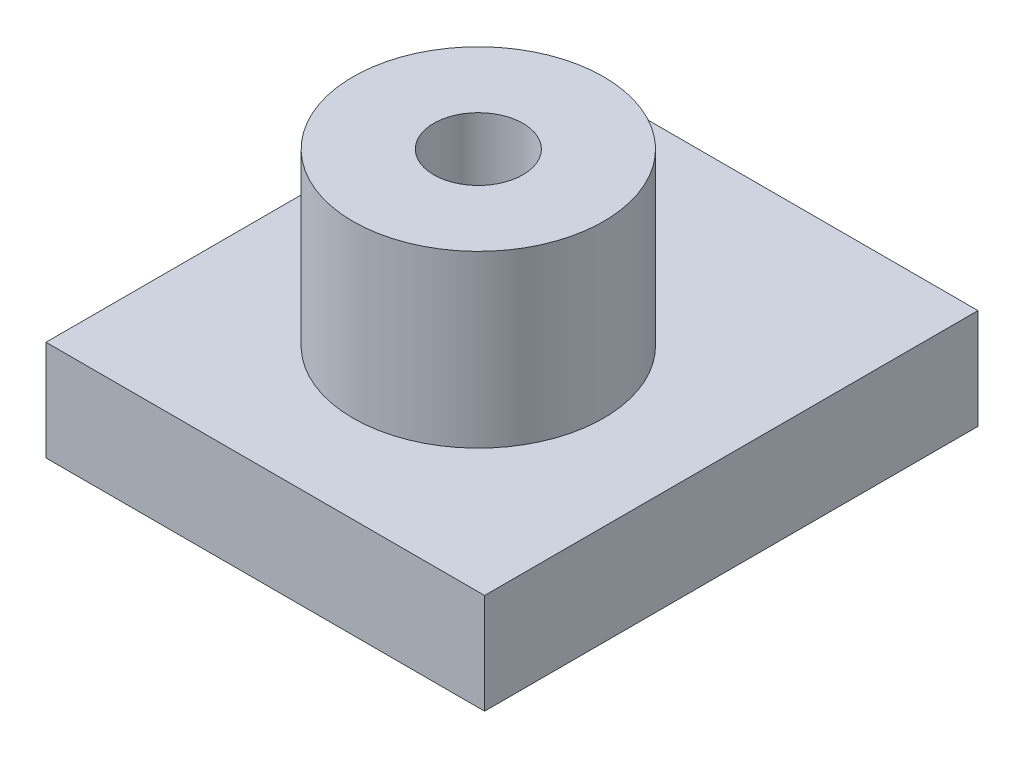
ISO-10303-21;
HEADER;
FILE_DESCRIPTION(('STEP AP214'),'2;1');
FILE_NAME('part.step','',(''),(''),'','','');
FILE_SCHEMA(('AUTOMOTIVE_DESIGN { 1 0 10303 214 1 1 1 1 }'));
ENDSEC;
DATA;
#1=APPLICATION_CONTEXT('core data for automotive mechanical design processes');
#2=APPLICATION_PROTOCOL_DEFINITION('international standard','automotive_design',2000,#1);
#3=PRODUCT_CONTEXT('',#1,'mechanical');
#4=PRODUCT('Part','Part','',(#3));
#5=PRODUCT_RELATED_PRODUCT_CATEGORY('part','',(#4));
#6=PRODUCT_DEFINITION_FORMATION('','',#4);
#7=PRODUCT_DEFINITION_CONTEXT('part definition',#1,'design');
#8=PRODUCT_DEFINITION('design','',#6,#7);
#9=PRODUCT_DEFINITION_SHAPE('','',#8);
#10=(LENGTH_UNIT() NAMED_UNIT(*) SI_UNIT(.MILLI.,.METRE.));
#11=(NAMED_UNIT(*) PLANE_ANGLE_UNIT() SI_UNIT($,.RADIAN.));
#12=(NAMED_UNIT(*) SI_UNIT($,.STERADIAN.) SOLID_ANGLE_UNIT());
#13=UNCERTAINTY_MEASURE_WITH_UNIT(LENGTH_MEASURE(1.E-05),#10,'distance_accuracy_value','');
#14=(GEOMETRIC_REPRESENTATION_CONTEXT(3) GLOBAL_UNCERTAINTY_ASSIGNED_CONTEXT((#13)) GLOBAL_UNIT_ASSIGNED_CONTEXT((#10,
#11,#12)) REPRESENTATION_CONTEXT('',''));
#15=CARTESIAN_POINT('',(0.,0.,0.));
#16=DIRECTION('',(0.,0.,1.));
#17=DIRECTION('',(1.,0.,0.));
#18=AXIS2_PLACEMENT_3D('',#15,#16,#17);
#19=CARTESIAN_POINT('',(5.55625,2.54,-10.6310486176108));
#20=DIRECTION('',(0.,1.,0.));
#21=DIRECTION('',(0.,0.,1.));
#22=AXIS2_PLACEMENT_3D('',#19,#20,#21);
#23=PLANE('',#22);
#24=DIRECTION('',(0.,0.,-1.));
#25=VECTOR('',#24,1.);
#26=CARTESIAN_POINT('',(5.55625,2.54,-23.1322986176108));
#27=LINE('',#26,#25);
#28=CARTESIAN_POINT('',(5.55625,2.54,-10.6310486176108));
#29=VERTEX_POINT('',#28);
#30=CARTESIAN_POINT('',(5.55625,2.54,-23.1322986176108));
#31=VERTEX_POINT('',#30);
#32=EDGE_CURVE('E87',#29,#31,#27,.T.);
#33=ORIENTED_EDGE('',*,*,#32,.T.);
#34=DIRECTION('',(-1.,0.,0.));
#35=VECTOR('',#34,1.);
#36=CARTESIAN_POINT('',(-5.55625,2.54,-23.1322986176108));
#37=LINE('',#36,#35);
#38=CARTESIAN_POINT('',(-5.55625,2.54,-23.1322986176108));
#39=VERTEX_POINT('',#38);
#40=EDGE_CURVE('E82',#31,#39,#37,.T.);
#41=ORIENTED_EDGE('',*,*,#40,.T.);
#42=DIRECTION('',(0.,0.,1.));
#43=VECTOR('',#42,1.);
#44=CARTESIAN_POINT('',(-5.55625,2.54,-23.1322986176108));
#45=LINE('',#44,#43);
#46=CARTESIAN_POINT('',(-5.55625,2.54,-10.6310486176108));
#47=VERTEX_POINT('',#46);
#48=EDGE_CURVE('E85',#39,#47,#45,.T.);
#49=ORIENTED_EDGE('',*,*,#48,.T.);
#50=DIRECTION('',(1.,0.,0.));
#51=VECTOR('',#50,1.);
#52=CARTESIAN_POINT('',(-5.55625,2.54,-10.6310486176108));
#53=LINE('',#52,#51);
#54=EDGE_CURVE('E52',#47,#29,#53,.T.);
#55=ORIENTED_EDGE('',*,*,#54,.T.);
#56=EDGE_LOOP('',(#33,#41,#49,#55));
#57=FACE_BOUND('',#56,.T.);
#58=CARTESIAN_POINT('',(0.,2.54,-16.0285486176108));
#59=DIRECTION('',(0.,1.,0.));
#60=DIRECTION('',(0.,0.,1.));
#61=AXIS2_PLACEMENT_3D('',#58,#59,#60);
#62=CIRCLE('',#61,3.175);
#63=CARTESIAN_POINT('',(0.,2.54,-19.2035486176108));
#64=VERTEX_POINT('',#63);
#65=EDGE_CURVE('E113',#64,#64,#62,.T.);
#66=ORIENTED_EDGE('',*,*,#65,.F.);
#67=EDGE_LOOP('',(#66));
#68=FACE_BOUND('',#67,.T.);
#69=ADVANCED_FACE('F35',(#57,#68),#23,.T.);
#70=CARTESIAN_POINT('',(5.55625,2.54,-23.1322986176108));
#71=DIRECTION('',(-1.,0.,0.));
#72=DIRECTION('',(0.,0.,1.));
#73=AXIS2_PLACEMENT_3D('',#70,#71,#72);
#74=PLANE('',#73);
#75=DIRECTION('',(0.,0.,-1.));
#76=VECTOR('',#75,1.);
#77=CARTESIAN_POINT('',(5.55625,0.,-23.1322986176108));
#78=LINE('',#77,#76);
#79=CARTESIAN_POINT('',(5.55625,0.,-10.6310486176108));
#80=VERTEX_POINT('',#79);
#81=CARTESIAN_POINT('',(5.55625,0.,-23.1322986176108));
#82=VERTEX_POINT('',#81);
#83=EDGE_CURVE('E99',#80,#82,#78,.T.);
#84=ORIENTED_EDGE('',*,*,#83,.T.);
#85=DIRECTION('',(0.,-1.,0.));
#86=VECTOR('',#85,1.);
#87=CARTESIAN_POINT('',(5.55625,2.54,-23.1322986176108));
#88=LINE('',#87,#86);
#89=EDGE_CURVE('E11',#31,#82,#88,.T.);
#90=ORIENTED_EDGE('',*,*,#89,.F.);
#91=ORIENTED_EDGE('',*,*,#32,.F.);
#92=DIRECTION('',(0.,-1.,0.));
#93=VECTOR('',#92,1.);
#94=CARTESIAN_POINT('',(5.55625,2.54,-10.6310486176108));
#95=LINE('',#94,#93);
#96=EDGE_CURVE('E95',#29,#80,#95,.T.);
#97=ORIENTED_EDGE('',*,*,#96,.T.);
#98=EDGE_LOOP('',(#84,#90,#91,#97));
#99=FACE_BOUND('',#98,.T.);
#100=ADVANCED_FACE('F37',(#99),#74,.F.);
#101=CARTESIAN_POINT('',(-5.55625,2.54,-23.1322986176108));
#102=DIRECTION('',(0.,0.,1.));
#103=DIRECTION('',(1.,0.,0.));
#104=AXIS2_PLACEMENT_3D('',#101,#102,#103);
#105=PLANE('',#104);
#106=DIRECTION('',(-1.,0.,0.));
#107=VECTOR('',#106,1.);
#108=CARTESIAN_POINT('',(-5.55625,0.,-23.1322986176108));
#109=LINE('',#108,#107);
#110=CARTESIAN_POINT('',(-5.55625,0.,-23.1322986176108));
#111=VERTEX_POINT('',#110);
#112=EDGE_CURVE('E91',#82,#111,#109,.T.);
#113=ORIENTED_EDGE('',*,*,#112,.T.);
#114=DIRECTION('',(0.,-1.,0.));
#115=VECTOR('',#114,1.);
#116=CARTESIAN_POINT('',(-5.55625,2.54,-23.1322986176108));
#117=LINE('',#116,#115);
#118=EDGE_CURVE('E44',#39,#111,#117,.T.);
#119=ORIENTED_EDGE('',*,*,#118,.F.);
#120=ORIENTED_EDGE('',*,*,#40,.F.);
#121=ORIENTED_EDGE('',*,*,#89,.T.);
#122=EDGE_LOOP('',(#113,#119,#120,#121));
#123=FACE_BOUND('',#122,.T.);
#124=ADVANCED_FACE('F90',(#123),#105,.F.);
#125=CARTESIAN_POINT('',(-5.55625,2.54,-23.1322986176108));
#126=DIRECTION('',(1.,0.,0.));
#127=DIRECTION('',(0.,0.,-1.));
#128=AXIS2_PLACEMENT_3D('',#125,#126,#127);
#129=PLANE('',#128);
#130=DIRECTION('',(0.,0.,1.));
#131=VECTOR('',#130,1.);
#132=CARTESIAN_POINT('',(-5.55625,0.,-23.1322986176108));
#133=LINE('',#132,#131);
#134=CARTESIAN_POINT('',(-5.55625,0.,-10.6310486176108));
#135=VERTEX_POINT('',#134);
#136=EDGE_CURVE('E69',#111,#135,#133,.T.);
#137=ORIENTED_EDGE('',*,*,#136,.T.);
#138=DIRECTION('',(0.,-1.,0.));
#139=VECTOR('',#138,1.);
#140=CARTESIAN_POINT('',(-5.55625,2.54,-10.6310486176108));
#141=LINE('',#140,#139);
#142=EDGE_CURVE('E92',#47,#135,#141,.T.);
#143=ORIENTED_EDGE('',*,*,#142,.F.);
#144=ORIENTED_EDGE('',*,*,#48,.F.);
#145=ORIENTED_EDGE('',*,*,#118,.T.);
#146=EDGE_LOOP('',(#137,#143,#144,#145));
#147=FACE_BOUND('',#146,.T.);
#148=ADVANCED_FACE('F93',(#147),#129,.F.);
#149=CARTESIAN_POINT('',(-5.55625,2.54,-10.6310486176108));
#150=DIRECTION('',(0.,0.,-1.));
#151=DIRECTION('',(-1.,0.,0.));
#152=AXIS2_PLACEMENT_3D('',#149,#150,#151);
#153=PLANE('',#152);
#154=DIRECTION('',(1.,0.,0.));
#155=VECTOR('',#154,1.);
#156=CARTESIAN_POINT('',(-5.55625,0.,-10.6310486176108));
#157=LINE('',#156,#155);
#158=EDGE_CURVE('E75',#135,#80,#157,.T.);
#159=ORIENTED_EDGE('',*,*,#158,.T.);
#160=ORIENTED_EDGE('',*,*,#96,.F.);
#161=ORIENTED_EDGE('',*,*,#54,.F.);
#162=ORIENTED_EDGE('',*,*,#142,.T.);
#163=EDGE_LOOP('',(#159,#160,#161,#162));
#164=FACE_BOUND('',#163,.T.);
#165=ADVANCED_FACE('F107',(#164),#153,.F.);
#166=CARTESIAN_POINT('',(5.55625,0.,-10.6310486176108));
#167=DIRECTION('',(0.,1.,0.));
#168=DIRECTION('',(0.,0.,1.));
#169=AXIS2_PLACEMENT_3D('',#166,#167,#168);
#170=PLANE('',#169);
#171=CARTESIAN_POINT('',(0.,0.,-16.0285486176108));
#172=DIRECTION('',(0.,1.,0.));
#173=DIRECTION('',(0.,0.,1.));
#174=AXIS2_PLACEMENT_3D('',#171,#172,#173);
#175=CIRCLE('',#174,1.1303);
#176=CARTESIAN_POINT('',(0.,0.,-14.8982486176108));
#177=VERTEX_POINT('',#176);
#178=EDGE_CURVE('E116',#177,#177,#175,.T.);
#179=ORIENTED_EDGE('',*,*,#178,.T.);
#180=EDGE_LOOP('',(#179));
#181=FACE_BOUND('',#180,.T.);
#182=ORIENTED_EDGE('',*,*,#83,.F.);
#183=ORIENTED_EDGE('',*,*,#158,.F.);
#184=ORIENTED_EDGE('',*,*,#136,.F.);
#185=ORIENTED_EDGE('',*,*,#112,.F.);
#186=EDGE_LOOP('',(#182,#183,#184,#185));
#187=FACE_BOUND('',#186,.T.);
#188=ADVANCED_FACE('F110',(#181,#187),#170,.F.);
#189=CARTESIAN_POINT('',(0.,6.858,-16.0285486176108));
#190=DIRECTION('',(0.,-1.,0.));
#191=DIRECTION('',(0.,0.,-1.));
#192=AXIS2_PLACEMENT_3D('',#189,#190,#191);
#193=CYLINDRICAL_SURFACE('',#192,3.175);
#194=CARTESIAN_POINT('',(0.,6.858,-16.0285486176108));
#195=DIRECTION('',(0.,1.,0.));
#196=DIRECTION('',(0.,0.,1.));
#197=AXIS2_PLACEMENT_3D('',#194,#195,#196);
#198=CIRCLE('',#197,3.175);
#199=CARTESIAN_POINT('',(0.,6.858,-19.2035486176108));
#200=VERTEX_POINT('',#199);
#201=EDGE_CURVE('E102',#200,#200,#198,.T.);
#202=CARTESIAN_POINT('',(0.,6.858,-19.2035486176108));
#203=CARTESIAN_POINT('',(0.,6.81302083333334,-19.2035486176108));
#204=CARTESIAN_POINT('',(0.,6.76804166666667,-19.2035486176108));
#205=CARTESIAN_POINT('',(0.,6.67808333333334,-19.2035486176108));
#206=CARTESIAN_POINT('',(0.,6.63310416666667,-19.2035486176108));
#207=CARTESIAN_POINT('',(0.,6.54314583333334,-19.2035486176108));
#208=CARTESIAN_POINT('',(0.,6.49816666666667,-19.2035486176108));
#209=CARTESIAN_POINT('',(0.,6.40820833333334,-19.2035486176108));
#210=CARTESIAN_POINT('',(0.,6.36322916666667,-19.2035486176108));
#211=CARTESIAN_POINT('',(0.,6.27327083333334,-19.2035486176108));
#212=CARTESIAN_POINT('',(0.,6.22829166666667,-19.2035486176108));
#213=CARTESIAN_POINT('',(0.,6.13833333333334,-19.2035486176108));
#214=CARTESIAN_POINT('',(0.,6.09335416666667,-19.2035486176108));
#215=CARTESIAN_POINT('',(0.,6.00339583333334,-19.2035486176108));
#216=CARTESIAN_POINT('',(0.,5.95841666666667,-19.2035486176108));
#217=CARTESIAN_POINT('',(0.,5.86845833333333,-19.2035486176108));
#218=CARTESIAN_POINT('',(0.,5.82347916666667,-19.2035486176108));
#219=CARTESIAN_POINT('',(0.,5.73352083333334,-19.2035486176108));
#220=CARTESIAN_POINT('',(0.,5.68854166666667,-19.2035486176108));
#221=CARTESIAN_POINT('',(0.,5.59858333333333,-19.2035486176108));
#222=CARTESIAN_POINT('',(0.,5.55360416666667,-19.2035486176108));
#223=CARTESIAN_POINT('',(0.,5.46364583333334,-19.2035486176108));
#224=CARTESIAN_POINT('',(0.,5.41866666666667,-19.2035486176108));
#225=CARTESIAN_POINT('',(0.,5.32870833333333,-19.2035486176108));
#226=CARTESIAN_POINT('',(0.,5.28372916666667,-19.2035486176108));
#227=CARTESIAN_POINT('',(0.,5.19377083333333,-19.2035486176108));
#228=CARTESIAN_POINT('',(0.,5.14879166666667,-19.2035486176108));
#229=CARTESIAN_POINT('',(0.,5.05883333333333,-19.2035486176108));
#230=CARTESIAN_POINT('',(0.,5.01385416666667,-19.2035486176108));
#231=CARTESIAN_POINT('',(0.,4.92389583333333,-19.2035486176108));
#232=CARTESIAN_POINT('',(0.,4.87891666666667,-19.2035486176108));
#233=CARTESIAN_POINT('',(0.,4.78895833333333,-19.2035486176108));
#234=CARTESIAN_POINT('',(0.,4.74397916666667,-19.2035486176108));
#235=CARTESIAN_POINT('',(0.,4.65402083333333,-19.2035486176108));
#236=CARTESIAN_POINT('',(0.,4.60904166666667,-19.2035486176108));
#237=CARTESIAN_POINT('',(0.,4.51908333333333,-19.2035486176108));
#238=CARTESIAN_POINT('',(0.,4.47410416666667,-19.2035486176108));
#239=CARTESIAN_POINT('',(0.,4.38414583333333,-19.2035486176108));
#240=CARTESIAN_POINT('',(0.,4.33916666666667,-19.2035486176108));
#241=CARTESIAN_POINT('',(0.,4.24920833333333,-19.2035486176108));
#242=CARTESIAN_POINT('',(0.,4.20422916666667,-19.2035486176108));
#243=CARTESIAN_POINT('',(0.,4.11427083333333,-19.2035486176108));
#244=CARTESIAN_POINT('',(0.,4.06929166666667,-19.2035486176108));
#245=CARTESIAN_POINT('',(0.,3.97933333333333,-19.2035486176108));
#246=CARTESIAN_POINT('',(0.,3.93435416666667,-19.2035486176108));
#247=CARTESIAN_POINT('',(0.,3.84439583333333,-19.2035486176108));
#248=CARTESIAN_POINT('',(0.,3.79941666666667,-19.2035486176108));
#249=CARTESIAN_POINT('',(0.,3.70945833333333,-19.2035486176108));
#250=CARTESIAN_POINT('',(0.,3.66447916666667,-19.2035486176108));
#251=CARTESIAN_POINT('',(0.,3.57452083333333,-19.2035486176108));
#252=CARTESIAN_POINT('',(0.,3.52954166666667,-19.2035486176108));
#253=CARTESIAN_POINT('',(0.,3.43958333333333,-19.2035486176108));
#254=CARTESIAN_POINT('',(0.,3.39460416666667,-19.2035486176108));
#255=CARTESIAN_POINT('',(0.,3.30464583333333,-19.2035486176108));
#256=CARTESIAN_POINT('',(0.,3.25966666666667,-19.2035486176108));
#257=CARTESIAN_POINT('',(0.,3.16970833333333,-19.2035486176108));
#258=CARTESIAN_POINT('',(0.,3.12472916666667,-19.2035486176108));
#259=CARTESIAN_POINT('',(0.,3.03477083333333,-19.2035486176108));
#260=CARTESIAN_POINT('',(0.,2.98979166666667,-19.2035486176108));
#261=CARTESIAN_POINT('',(0.,2.89983333333333,-19.2035486176108));
#262=CARTESIAN_POINT('',(0.,2.85485416666667,-19.2035486176108));
#263=CARTESIAN_POINT('',(0.,2.76489583333333,-19.2035486176108));
#264=CARTESIAN_POINT('',(0.,2.71991666666667,-19.2035486176108));
#265=CARTESIAN_POINT('',(0.,2.62995833333333,-19.2035486176108));
#266=CARTESIAN_POINT('',(0.,2.58497916666667,-19.2035486176108));
#267=CARTESIAN_POINT('',(0.,2.54,-19.2035486176108));
#268=B_SPLINE_CURVE_WITH_KNOTS('',3,(#202,#203,#204,#205,#206,#207,#208,#209,#210,#211,#212,
#213,#214,#215,#216,#217,#218,#219,#220,#221,#222,#223,#224,#225,#226,#227,#228,#229,#230,#231,
#232,#233,#234,#235,#236,#237,#238,#239,#240,#241,#242,#243,#244,#245,#246,#247,#248,#249,#250,
#251,#252,#253,#254,#255,#256,#257,#258,#259,#260,#261,#262,#263,#264,#265,#266,#267),
.UNSPECIFIED.,.F.,.F.,(4,2,2,2,2,2,2,2,2,2,2,2,2,2,2,2,2,2,2,2,2,2,2,2,2,2,2,2,2,2,2,2,4),(0.,
0.134937500000001,0.269875000000001,0.404812500000001,0.539750000000001,0.674687500000001,
0.809625000000001,0.944562500000001,1.0795,1.2144375,1.349375,1.4843125,1.61925,1.7541875,
1.889125,2.0240625,2.159,2.2939375,2.428875,2.5638125,2.69875,2.8336875,2.968625,3.1035625,
3.2385,3.3734375,3.508375,3.6433125,3.77825,3.9131875,4.048125,4.1830625,4.318),.UNSPECIFIED.);
#269=EDGE_CURVE('BSEAM130',#200,#64,#268,.T.);
#270=ORIENTED_EDGE('',*,*,#201,.F.);
#271=ORIENTED_EDGE('',*,*,#65,.T.);
#272=ORIENTED_EDGE('',*,*,#269,.T.);
#273=ORIENTED_EDGE('',*,*,#269,.F.);
#274=EDGE_LOOP('',(#270,#272,#271,#273));
#275=FACE_BOUND('',#274,.T.);
#276=ADVANCED_FACE('F130',(#275),#193,.T.);
#277=CARTESIAN_POINT('',(0.,6.858,-16.0285486176108));
#278=DIRECTION('',(0.,1.,0.));
#279=DIRECTION('',(0.,0.,1.));
#280=AXIS2_PLACEMENT_3D('',#277,#278,#279);
#281=PLANE('',#280);
#282=CARTESIAN_POINT('',(0.,6.858,-16.0285486176108));
#283=DIRECTION('',(0.,1.,0.));
#284=DIRECTION('',(0.,0.,1.));
#285=AXIS2_PLACEMENT_3D('',#282,#283,#284);
#286=CIRCLE('',#285,1.1303);
#287=CARTESIAN_POINT('',(0.,6.858,-14.8982486176108));
#288=VERTEX_POINT('',#287);
#289=EDGE_CURVE('E121',#288,#288,#286,.T.);
#290=ORIENTED_EDGE('',*,*,#289,.F.);
#291=EDGE_LOOP('',(#290));
#292=FACE_BOUND('',#291,.T.);
#293=ORIENTED_EDGE('',*,*,#201,.T.);
#294=EDGE_LOOP('',(#293));
#295=FACE_BOUND('',#294,.T.);
#296=ADVANCED_FACE('F127',(#292,#295),#281,.T.);
#297=CARTESIAN_POINT('',(0.,6.858,-16.0285486176108));
#298=DIRECTION('',(0.,1.,0.));
#299=DIRECTION('',(0.,0.,1.));
#300=AXIS2_PLACEMENT_3D('',#297,#298,#299);
#301=CYLINDRICAL_SURFACE('',#300,1.1303);
#302=ORIENTED_EDGE('',*,*,#178,.F.);
#303=EDGE_LOOP('',(#302));
#304=FACE_BOUND('',#303,.T.);
#305=ORIENTED_EDGE('',*,*,#289,.T.);
#306=EDGE_LOOP('',(#305));
#307=FACE_BOUND('',#306,.T.);
#308=ADVANCED_FACE('F125',(#304,#307),#301,.F.);
#309=CLOSED_SHELL('',(#69,#100,#124,#148,#165,#188,#276,#296,#308));
#310=MANIFOLD_SOLID_BREP('B2',#309);
#311=ADVANCED_BREP_SHAPE_REPRESENTATION('',(#18,#310),#14);
#312=SHAPE_DEFINITION_REPRESENTATION(#9,#311);
ENDSEC;
END-ISO-10303-21;
